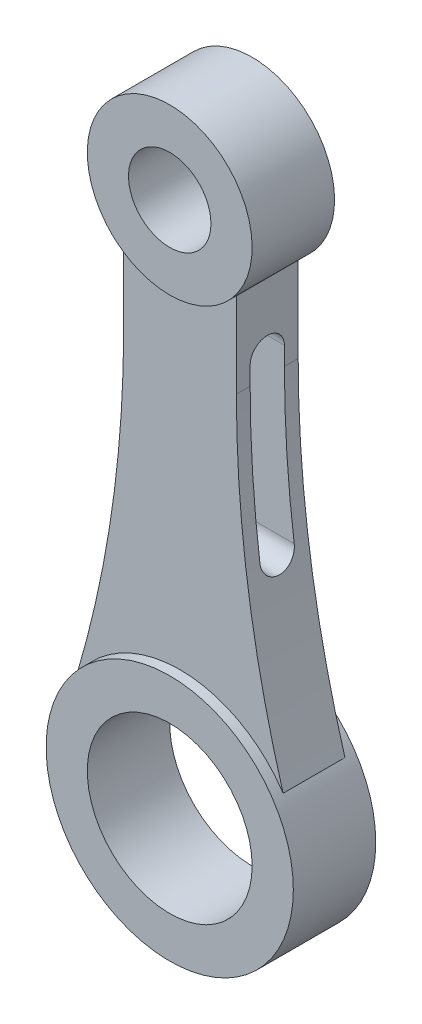
ISO-10303-21;
HEADER;
FILE_DESCRIPTION(('STEP AP214'),'2;1');
FILE_NAME('part.step','',(''),(''),'','','');
FILE_SCHEMA(('AUTOMOTIVE_DESIGN { 1 0 10303 214 1 1 1 1 }'));
ENDSEC;
DATA;
#1=APPLICATION_CONTEXT('core data for automotive mechanical design processes');
#2=APPLICATION_PROTOCOL_DEFINITION('international standard','automotive_design',2000,#1);
#3=PRODUCT_CONTEXT('',#1,'mechanical');
#4=PRODUCT('Part','Part','',(#3));
#5=PRODUCT_RELATED_PRODUCT_CATEGORY('part','',(#4));
#6=PRODUCT_DEFINITION_FORMATION('','',#4);
#7=PRODUCT_DEFINITION_CONTEXT('part definition',#1,'design');
#8=PRODUCT_DEFINITION('design','',#6,#7);
#9=PRODUCT_DEFINITION_SHAPE('','',#8);
#10=(LENGTH_UNIT() NAMED_UNIT(*) SI_UNIT(.MILLI.,.METRE.));
#11=(NAMED_UNIT(*) PLANE_ANGLE_UNIT() SI_UNIT($,.RADIAN.));
#12=(NAMED_UNIT(*) SI_UNIT($,.STERADIAN.) SOLID_ANGLE_UNIT());
#13=UNCERTAINTY_MEASURE_WITH_UNIT(LENGTH_MEASURE(1.E-05),#10,'distance_accuracy_value','');
#14=(GEOMETRIC_REPRESENTATION_CONTEXT(3) GLOBAL_UNCERTAINTY_ASSIGNED_CONTEXT((#13)) GLOBAL_UNIT_ASSIGNED_CONTEXT((#10,
#11,#12)) REPRESENTATION_CONTEXT('',''));
#15=CARTESIAN_POINT('',(0.,0.,0.));
#16=DIRECTION('',(0.,0.,1.));
#17=DIRECTION('',(1.,0.,0.));
#18=AXIS2_PLACEMENT_3D('',#15,#16,#17);
#19=CARTESIAN_POINT('',(288.972030603066,15.820153121076,7.5));
#20=DIRECTION('',(0.,0.,-1.));
#21=DIRECTION('',(-1.,0.,0.));
#22=AXIS2_PLACEMENT_3D('',#19,#20,#21);
#23=CYLINDRICAL_SURFACE('',#22,275.291564850654);
#24=CARTESIAN_POINT('',(288.972030603066,15.820153121076,-4.15667908285283));
#25=DIRECTION('',(0.,0.,-1.));
#26=DIRECTION('',(-1.,0.,0.));
#27=AXIS2_PLACEMENT_3D('',#24,#25,#26);
#28=CIRCLE('',#27,275.291564850654);
#29=CARTESIAN_POINT('',(16.0549031940235,-20.2587499209833,-4.15667908285283));
#30=VERTEX_POINT('',#29);
#31=CARTESIAN_POINT('',(13.6804657524121,15.8201531210742,-4.15667908285283));
#32=VERTEX_POINT('',#31);
#33=EDGE_CURVE('E280',#30,#32,#28,.T.);
#34=ORIENTED_EDGE('',*,*,#33,.F.);
#35=CARTESIAN_POINT('',(16.0549031940235,-20.2587499209833,4.15667908285283));
#36=CARTESIAN_POINT('',(16.0704750097521,-20.3765480732176,4.15669109499393));
#37=CARTESIAN_POINT('',(16.0861243485884,-20.4943340439329,4.15167208317998));
#38=CARTESIAN_POINT('',(16.117462026951,-20.7290464404043,4.13166399065926));
#39=CARTESIAN_POINT('',(16.1331503649198,-20.8459728997726,4.11667530194636));
#40=CARTESIAN_POINT('',(16.1644436258058,-21.0780840185345,4.07682951459496));
#41=CARTESIAN_POINT('',(16.1800485855865,-21.1932694975232,4.05197721978021));
#42=CARTESIAN_POINT('',(16.2110637106805,-21.421138908205,3.99257985109576));
#43=CARTESIAN_POINT('',(16.226473878494,-21.5338228720189,3.95803490176329));
#44=CARTESIAN_POINT('',(16.256984243972,-21.7559262394368,3.87947477803732));
#45=CARTESIAN_POINT('',(16.2720843370173,-21.8653445466753,3.83545646302295));
#46=CARTESIAN_POINT('',(16.3018533053091,-22.0801351480103,3.73824000055474));
#47=CARTESIAN_POINT('',(16.3165220190609,-22.1855059312499,3.685038465132));
#48=CARTESIAN_POINT('',(16.3452922923064,-22.391337690277,3.56986691507419));
#49=CARTESIAN_POINT('',(16.3593941903908,-22.4918016051676,3.50790223821111));
#50=CARTESIAN_POINT('',(16.38692560726,-22.6871962030394,3.37558239559216));
#51=CARTESIAN_POINT('',(16.4003548771866,-22.7821248401878,3.30522415648358));
#52=CARTESIAN_POINT('',(16.4263729956737,-22.9653949072757,3.15688199766906));
#53=CARTESIAN_POINT('',(16.4389646026604,-23.0537580824605,3.0789254282231));
#54=CARTESIAN_POINT('',(16.4632509047328,-23.2236432199694,2.91569375558122));
#55=CARTESIAN_POINT('',(16.4749452656218,-23.3051626342577,2.83041595026955));
#56=CARTESIAN_POINT('',(16.4973225703017,-23.4606988819621,2.65318691462642));
#57=CARTESIAN_POINT('',(16.5080057646781,-23.5347175745175,2.56123734771108));
#58=CARTESIAN_POINT('',(16.5282682690525,-23.674745939291,2.37126163432076));
#59=CARTESIAN_POINT('',(16.5378471731989,-23.7407526673991,2.27323327397858));
#60=CARTESIAN_POINT('',(16.5557209761364,-23.8636439276749,2.07277864843456));
#61=CARTESIAN_POINT('',(16.5640270875125,-23.9206082999292,1.97040232499818));
#62=CARTESIAN_POINT('',(16.5793859557047,-24.0257456024338,1.76109219362114));
#63=CARTESIAN_POINT('',(16.5864382492999,-24.0739152836775,1.65415671932486));
#64=CARTESIAN_POINT('',(16.5992142815433,-24.1610492991238,1.43658137523913));
#65=CARTESIAN_POINT('',(16.6049386596134,-24.2000180639418,1.3259433178196));
#66=CARTESIAN_POINT('',(16.615009018863,-24.2684945167983,1.10167288386381));
#67=CARTESIAN_POINT('',(16.6193544938695,-24.2979987305957,0.988039424303515));
#68=CARTESIAN_POINT('',(16.62658444997,-24.3470505757274,0.75977784754567));
#69=CARTESIAN_POINT('',(16.6294830808742,-24.3666946480874,0.645170979485073));
#70=CARTESIAN_POINT('',(16.6338574959347,-24.3963279363351,0.414677459145485));
#71=CARTESIAN_POINT('',(16.6353327570886,-24.4063136033452,0.29879035226344));
#72=CARTESIAN_POINT('',(16.6375916159939,-24.4216074893232,-0.0494558675508221));
#73=CARTESIAN_POINT('',(16.6362162655536,-24.4123065739147,-0.282652058389253));
#74=CARTESIAN_POINT('',(16.6277655878344,-24.3550601302369,-0.742833795180447));
#75=CARTESIAN_POINT('',(16.62071859089,-24.3073066749393,-0.96984442571743));
#76=CARTESIAN_POINT('',(16.6012367613109,-24.1748565020315,-1.41260430430548));
#77=CARTESIAN_POINT('',(16.5888019159399,-24.090159697092,-1.62835352573473));
#78=CARTESIAN_POINT('',(16.5589761590796,-23.8860687631105,-2.0430619818794));
#79=CARTESIAN_POINT('',(16.5415726466099,-23.7665863993971,-2.24197683878745));
#80=CARTESIAN_POINT('',(16.5024634081142,-23.4964995654215,-2.6169316652615));
#81=CARTESIAN_POINT('',(16.4807577236965,-23.3458953961527,-2.79297185603215));
#82=CARTESIAN_POINT('',(16.4336197138268,-23.0165324433995,-3.11877449903784));
#83=CARTESIAN_POINT('',(16.4081577327821,-22.8375486767689,-3.26830481070464));
#84=CARTESIAN_POINT('',(16.3544891033389,-22.4572354955944,-3.53533233211329));
#85=CARTESIAN_POINT('',(16.3262814395494,-22.2558978103655,-3.652817629634));
#86=CARTESIAN_POINT('',(16.2824958580279,-21.940604806989,-3.80304597232787));
#87=CARTESIAN_POINT('',(16.2675666941747,-21.8326467119248,-3.84897248428845));
#88=CARTESIAN_POINT('',(16.2373697333055,-21.6132899430774,-3.9315276179245));
#89=CARTESIAN_POINT('',(16.2221020614005,-21.5018925346648,-3.96815961451344));
#90=CARTESIAN_POINT('',(16.1913634448971,-21.2765614057563,-4.03184104505021));
#91=CARTESIAN_POINT('',(16.1758927345791,-21.1626305184068,-4.05890066214979));
#92=CARTESIAN_POINT('',(16.144853475086,-20.9329489665742,-4.10330422626165));
#93=CARTESIAN_POINT('',(16.1292849769129,-20.8171992099641,-4.12065287138709));
#94=CARTESIAN_POINT('',(16.1038891978573,-20.6274611484018,-4.14095374530003));
#95=CARTESIAN_POINT('',(16.0940570014208,-20.553776157277,-4.14685429102821));
#96=CARTESIAN_POINT('',(16.0744412992162,-20.4063146163928,-4.15471407109939));
#97=CARTESIAN_POINT('',(16.0646577397256,-20.3325384214504,-4.15667982923061));
#98=CARTESIAN_POINT('',(16.0549031940235,-20.2587499209833,-4.15667908285283));
#99=B_SPLINE_CURVE_WITH_KNOTS('',3,(#35,#36,#37,#38,#39,#40,#41,#42,#43,#44,#45,#46,#47,#48,#49,
#50,#51,#52,#53,#54,#55,#56,#57,#58,#59,#60,#61,#62,#63,#64,#65,#66,#67,#68,#69,#70,#71,#72,#73,
#74,#75,#76,#77,#78,#79,#80,#81,#82,#83,#84,#85,#86,#87,#88,#89,#90,#91,#92,#93,#94,#95,#96,#97,
#98),.UNSPECIFIED.,.F.,.F.,(4,2,2,2,2,2,2,2,2,2,2,2,2,2,2,2,2,2,2,2,2,2,2,2,2,2,2,2,2,2,2,4),
(0.,0.356360122110577,0.712706233463274,1.06887900786146,1.42504720614111,1.78133366409383,
2.13775184898646,2.4939538614253,2.85028670198657,3.20538122444211,3.56060737300243,
3.91574525823706,4.27101325137021,4.62294516003498,4.97500682034743,5.32689860130546,
5.67891940703861,6.02742655795546,6.37606171550282,7.07256784322536,7.76561630007947,
8.45866639521693,9.1534899823752,9.8483068498878,10.5489360788957,11.2498254017442,
11.6042840321903,11.9586137710613,12.3125654303134,12.6663457014296,12.8899655255622,
13.113214285),.UNSPECIFIED.);
#100=CARTESIAN_POINT('',(16.0549031940235,-20.2587499209833,4.15667908285283));
#101=VERTEX_POINT('',#100);
#102=EDGE_CURVE('E216',#101,#30,#99,.T.);
#103=ORIENTED_EDGE('',*,*,#102,.F.);
#104=CARTESIAN_POINT('',(288.972030603066,15.820153121076,4.15667908285283));
#105=DIRECTION('',(0.,0.,1.));
#106=DIRECTION('',(1.,0.,0.));
#107=AXIS2_PLACEMENT_3D('',#104,#105,#106);
#108=CIRCLE('',#107,275.291564850654);
#109=CARTESIAN_POINT('',(13.6804657524121,15.8201531210742,4.15667908285283));
#110=VERTEX_POINT('',#109);
#111=EDGE_CURVE('E214',#110,#101,#108,.T.);
#112=ORIENTED_EDGE('',*,*,#111,.F.);
#113=DIRECTION('',(0.,0.,-1.));
#114=VECTOR('',#113,1.);
#115=CARTESIAN_POINT('',(13.6804657524121,15.8201531210742,7.5));
#116=LINE('',#115,#114);
#117=CARTESIAN_POINT('',(13.6804657524121,15.8201531210742,7.5));
#118=VERTEX_POINT('',#117);
#119=EDGE_CURVE('E286',#118,#110,#116,.T.);
#120=ORIENTED_EDGE('',*,*,#119,.F.);
#121=CARTESIAN_POINT('',(288.972030603066,15.820153121076,7.5));
#122=DIRECTION('',(0.,0.,1.));
#123=DIRECTION('',(1.,0.,0.));
#124=AXIS2_PLACEMENT_3D('',#121,#122,#123);
#125=CIRCLE('',#124,275.291564850654);
#126=CARTESIAN_POINT('',(25.0234279366621,-62.3884194804921,7.5));
#127=VERTEX_POINT('',#126);
#128=EDGE_CURVE('E305',#118,#127,#125,.T.);
#129=ORIENTED_EDGE('',*,*,#128,.T.);
#130=DIRECTION('',(0.,0.,-1.));
#131=VECTOR('',#130,1.);
#132=CARTESIAN_POINT('',(25.0234279366621,-62.3884194804921,7.5));
#133=LINE('',#132,#131);
#134=CARTESIAN_POINT('',(25.0234279366621,-62.3884194804921,-7.5));
#135=VERTEX_POINT('',#134);
#136=EDGE_CURVE('E299',#127,#135,#133,.T.);
#137=ORIENTED_EDGE('',*,*,#136,.T.);
#138=CARTESIAN_POINT('',(288.972030603066,15.820153121076,-7.5));
#139=DIRECTION('',(0.,0.,1.));
#140=DIRECTION('',(1.,0.,0.));
#141=AXIS2_PLACEMENT_3D('',#138,#139,#140);
#142=CIRCLE('',#141,275.291564850654);
#143=CARTESIAN_POINT('',(13.6804657524121,15.8201531210742,-7.5));
#144=VERTEX_POINT('',#143);
#145=EDGE_CURVE('E284',#144,#135,#142,.T.);
#146=ORIENTED_EDGE('',*,*,#145,.F.);
#147=EDGE_CURVE('E274',#32,#144,#116,.T.);
#148=ORIENTED_EDGE('',*,*,#147,.F.);
#149=EDGE_LOOP('',(#34,#103,#112,#120,#129,#137,#146,#148));
#150=FACE_BOUND('',#149,.T.);
#151=ADVANCED_FACE('F47',(#150),#23,.F.);
#152=CARTESIAN_POINT('',(13.6804657524122,0.,7.5));
#153=DIRECTION('',(1.,0.,0.));
#154=DIRECTION('',(0.,1.,0.));
#155=AXIS2_PLACEMENT_3D('',#152,#153,#154);
#156=PLANE('',#155);
#157=DIRECTION('',(0.,1.,0.));
#158=VECTOR('',#157,1.);
#159=CARTESIAN_POINT('',(13.6804657524122,0.,-4.15667908285283));
#160=LINE('',#159,#158);
#161=CARTESIAN_POINT('',(13.680465752412,20.2587499209833,-4.15667908285283));
#162=VERTEX_POINT('',#161);
#163=EDGE_CURVE('E271',#32,#162,#160,.T.);
#164=ORIENTED_EDGE('',*,*,#163,.F.);
#165=ORIENTED_EDGE('',*,*,#147,.T.);
#166=DIRECTION('',(0.,-1.,0.));
#167=VECTOR('',#166,1.);
#168=CARTESIAN_POINT('',(13.6804657524122,0.,-7.5));
#169=LINE('',#168,#167);
#170=CARTESIAN_POINT('',(13.6804657524119,36.4746263546214,-7.5));
#171=VERTEX_POINT('',#170);
#172=EDGE_CURVE('E315',#171,#144,#169,.T.);
#173=ORIENTED_EDGE('',*,*,#172,.F.);
#174=DIRECTION('',(0.,0.,-1.));
#175=VECTOR('',#174,1.);
#176=CARTESIAN_POINT('',(13.6804657524119,36.4746263546214,7.5));
#177=LINE('',#176,#175);
#178=CARTESIAN_POINT('',(13.6804657524119,36.4746263546214,7.5));
#179=VERTEX_POINT('',#178);
#180=EDGE_CURVE('E287',#179,#171,#177,.T.);
#181=ORIENTED_EDGE('',*,*,#180,.F.);
#182=DIRECTION('',(0.,-1.,0.));
#183=VECTOR('',#182,1.);
#184=CARTESIAN_POINT('',(13.6804657524122,0.,7.5));
#185=LINE('',#184,#183);
#186=EDGE_CURVE('E327',#179,#118,#185,.T.);
#187=ORIENTED_EDGE('',*,*,#186,.T.);
#188=ORIENTED_EDGE('',*,*,#119,.T.);
#189=DIRECTION('',(0.,-1.,0.));
#190=VECTOR('',#189,1.);
#191=CARTESIAN_POINT('',(13.6804657524122,0.,4.15667908285283));
#192=LINE('',#191,#190);
#193=CARTESIAN_POINT('',(13.680465752412,20.2587499209833,4.15667908285283));
#194=VERTEX_POINT('',#193);
#195=EDGE_CURVE('E212',#194,#110,#192,.T.);
#196=ORIENTED_EDGE('',*,*,#195,.F.);
#197=CARTESIAN_POINT('',(13.680465752412,20.2587499209833,0.));
#198=DIRECTION('',(1.,0.,0.));
#199=DIRECTION('',(0.,1.,0.));
#200=AXIS2_PLACEMENT_3D('',#197,#198,#199);
#201=CIRCLE('',#200,4.15667908285283);
#202=EDGE_CURVE('E277',#162,#194,#201,.T.);
#203=ORIENTED_EDGE('',*,*,#202,.F.);
#204=EDGE_LOOP('',(#164,#165,#173,#181,#187,#188,#196,#203));
#205=FACE_BOUND('',#204,.T.);
#206=ADVANCED_FACE('F261',(#205),#156,.T.);
#207=CARTESIAN_POINT('',(0.,51.0638297871971,7.5));
#208=DIRECTION('',(0.,0.,-1.));
#209=DIRECTION('',(-1.,0.,0.));
#210=AXIS2_PLACEMENT_3D('',#207,#208,#209);
#211=CYLINDRICAL_SURFACE('',#210,20.);
#212=CARTESIAN_POINT('',(0.,51.0638297871971,-7.5));
#213=DIRECTION('',(0.,0.,1.));
#214=DIRECTION('',(1.,0.,0.));
#215=AXIS2_PLACEMENT_3D('',#212,#213,#214);
#216=CIRCLE('',#215,20.);
#217=CARTESIAN_POINT('',(-13.6804657524122,36.4746263546214,-7.5));
#218=VERTEX_POINT('',#217);
#219=EDGE_CURVE('E312',#218,#171,#216,.T.);
#220=ORIENTED_EDGE('',*,*,#219,.F.);
#221=DIRECTION('',(0.,0.,-1.));
#222=VECTOR('',#221,1.);
#223=CARTESIAN_POINT('',(-13.6804657524122,36.4746263546214,7.5));
#224=LINE('',#223,#222);
#225=CARTESIAN_POINT('',(-13.6804657524122,36.4746263546214,7.5));
#226=VERTEX_POINT('',#225);
#227=EDGE_CURVE('E289',#226,#218,#224,.T.);
#228=ORIENTED_EDGE('',*,*,#227,.F.);
#229=CARTESIAN_POINT('',(0.,51.0638297871971,7.5));
#230=DIRECTION('',(0.,0.,1.));
#231=DIRECTION('',(1.,0.,0.));
#232=AXIS2_PLACEMENT_3D('',#229,#230,#231);
#233=CIRCLE('',#232,20.);
#234=EDGE_CURVE('E324',#226,#179,#233,.T.);
#235=ORIENTED_EDGE('',*,*,#234,.T.);
#236=ORIENTED_EDGE('',*,*,#180,.T.);
#237=EDGE_LOOP('',(#220,#228,#235,#236));
#238=FACE_BOUND('',#237,.T.);
#239=ADVANCED_FACE('F258',(#238),#211,.F.);
#240=CARTESIAN_POINT('',(-13.6804657524122,0.,7.5));
#241=DIRECTION('',(1.,0.,0.));
#242=DIRECTION('',(0.,1.,0.));
#243=AXIS2_PLACEMENT_3D('',#240,#241,#242);
#244=PLANE('',#243);
#245=DIRECTION('',(0.,0.,-1.));
#246=VECTOR('',#245,1.);
#247=CARTESIAN_POINT('',(-13.6804657524122,15.8201531210742,7.5));
#248=LINE('',#247,#246);
#249=CARTESIAN_POINT('',(-13.6804657524121,15.8201531210742,-4.15667908285283));
#250=VERTEX_POINT('',#249);
#251=CARTESIAN_POINT('',(-13.6804657524122,15.8201531210742,-7.5));
#252=VERTEX_POINT('',#251);
#253=EDGE_CURVE('E296',#250,#252,#248,.T.);
#254=ORIENTED_EDGE('',*,*,#253,.F.);
#255=DIRECTION('',(0.,1.,0.));
#256=VECTOR('',#255,1.);
#257=CARTESIAN_POINT('',(-13.6804657524122,0.,-4.15667908285283));
#258=LINE('',#257,#256);
#259=CARTESIAN_POINT('',(-13.6804657524122,20.2587499209833,-4.15667908285283));
#260=VERTEX_POINT('',#259);
#261=EDGE_CURVE('E223',#250,#260,#258,.T.);
#262=ORIENTED_EDGE('',*,*,#261,.T.);
#263=CARTESIAN_POINT('',(-13.6804657524122,20.2587499209833,0.));
#264=DIRECTION('',(1.,0.,0.));
#265=DIRECTION('',(0.,1.,0.));
#266=AXIS2_PLACEMENT_3D('',#263,#264,#265);
#267=CIRCLE('',#266,4.15667908285283);
#268=CARTESIAN_POINT('',(-13.6804657524122,20.2587499209833,4.15667908285283));
#269=VERTEX_POINT('',#268);
#270=EDGE_CURVE('E12',#260,#269,#267,.T.);
#271=ORIENTED_EDGE('',*,*,#270,.T.);
#272=DIRECTION('',(0.,-1.,0.));
#273=VECTOR('',#272,1.);
#274=CARTESIAN_POINT('',(-13.6804657524122,0.,4.15667908285283));
#275=LINE('',#274,#273);
#276=CARTESIAN_POINT('',(-13.6804657524121,15.8201531210742,4.15667908285283));
#277=VERTEX_POINT('',#276);
#278=EDGE_CURVE('E204',#269,#277,#275,.T.);
#279=ORIENTED_EDGE('',*,*,#278,.T.);
#280=CARTESIAN_POINT('',(-13.6804657524122,15.8201531210742,7.5));
#281=VERTEX_POINT('',#280);
#282=EDGE_CURVE('E293',#281,#277,#248,.T.);
#283=ORIENTED_EDGE('',*,*,#282,.F.);
#284=DIRECTION('',(0.,-1.,0.));
#285=VECTOR('',#284,1.);
#286=CARTESIAN_POINT('',(-13.6804657524122,0.,7.5));
#287=LINE('',#286,#285);
#288=EDGE_CURVE('E322',#226,#281,#287,.T.);
#289=ORIENTED_EDGE('',*,*,#288,.F.);
#290=ORIENTED_EDGE('',*,*,#227,.T.);
#291=DIRECTION('',(0.,-1.,0.));
#292=VECTOR('',#291,1.);
#293=CARTESIAN_POINT('',(-13.6804657524122,0.,-7.5));
#294=LINE('',#293,#292);
#295=EDGE_CURVE('E309',#218,#252,#294,.T.);
#296=ORIENTED_EDGE('',*,*,#295,.T.);
#297=EDGE_LOOP('',(#254,#262,#271,#279,#283,#289,#290,#296));
#298=FACE_BOUND('',#297,.T.);
#299=ADVANCED_FACE('F253',(#298),#244,.F.);
#300=CARTESIAN_POINT('',(-288.972030603066,15.8201531210742,7.5));
#301=DIRECTION('',(0.,0.,-1.));
#302=DIRECTION('',(-1.,0.,0.));
#303=AXIS2_PLACEMENT_3D('',#300,#301,#302);
#304=CYLINDRICAL_SURFACE('',#303,275.291564850654);
#305=CARTESIAN_POINT('',(-16.0549031940234,-20.2587499209833,4.15667908285283));
#306=CARTESIAN_POINT('',(-16.0704750097519,-20.3765480732176,4.15669109499393));
#307=CARTESIAN_POINT('',(-16.0861243485883,-20.4943340439329,4.15167208317998));
#308=CARTESIAN_POINT('',(-16.1174620269509,-20.7290464404043,4.13166399065926));
#309=CARTESIAN_POINT('',(-16.1331503649197,-20.8459728997726,4.11667530194636));
#310=CARTESIAN_POINT('',(-16.1644436258057,-21.0780840185345,4.07682951459496));
#311=CARTESIAN_POINT('',(-16.1800485855863,-21.1932694975232,4.05197721978021));
#312=CARTESIAN_POINT('',(-16.2110637106804,-21.4211389082049,3.99257985109576));
#313=CARTESIAN_POINT('',(-16.2264738784939,-21.5338228720189,3.95803490176329));
#314=CARTESIAN_POINT('',(-16.2569842439719,-21.7559262394368,3.87947477803732));
#315=CARTESIAN_POINT('',(-16.2720843370171,-21.8653445466753,3.83545646302296));
#316=CARTESIAN_POINT('',(-16.301853305309,-22.0801351480103,3.73824000055475));
#317=CARTESIAN_POINT('',(-16.3165220190608,-22.1855059312499,3.68503846513201));
#318=CARTESIAN_POINT('',(-16.3452922923063,-22.391337690277,3.5698669150742));
#319=CARTESIAN_POINT('',(-16.3593941903907,-22.4918016051676,3.50790223821112));
#320=CARTESIAN_POINT('',(-16.3869256072598,-22.6871962030394,3.37558239559216));
#321=CARTESIAN_POINT('',(-16.4003548771865,-22.7821248401878,3.30522415648358));
#322=CARTESIAN_POINT('',(-16.4263729956735,-22.9653949072757,3.15688199766908));
#323=CARTESIAN_POINT('',(-16.4389646026602,-23.0537580824605,3.07892542822311));
#324=CARTESIAN_POINT('',(-16.4632509047326,-23.2236432199694,2.91569375558124));
#325=CARTESIAN_POINT('',(-16.4749452656216,-23.3051626342577,2.83041595026956));
#326=CARTESIAN_POINT('',(-16.4973225703015,-23.460698881962,2.65318691462643));
#327=CARTESIAN_POINT('',(-16.508005764678,-23.5347175745175,2.56123734771109));
#328=CARTESIAN_POINT('',(-16.5282682690524,-23.674745939291,2.37126163432077));
#329=CARTESIAN_POINT('',(-16.5378471731987,-23.7407526673991,2.27323327397858));
#330=CARTESIAN_POINT('',(-16.5557209761362,-23.8636439276749,2.07277864843457));
#331=CARTESIAN_POINT('',(-16.5640270875124,-23.9206082999291,1.9704023249982));
#332=CARTESIAN_POINT('',(-16.5793859557046,-24.0257456024338,1.76109219362116));
#333=CARTESIAN_POINT('',(-16.5864382492998,-24.0739152836775,1.65415671932488));
#334=CARTESIAN_POINT('',(-16.5992142815431,-24.1610492991238,1.43658137523914));
#335=CARTESIAN_POINT('',(-16.6049386596132,-24.2000180639418,1.32594331781962));
#336=CARTESIAN_POINT('',(-16.6150090188628,-24.2684945167983,1.10167288386383));
#337=CARTESIAN_POINT('',(-16.6193544938693,-24.2979987305957,0.988039424303529));
#338=CARTESIAN_POINT('',(-16.6265844499699,-24.3470505757274,0.759777847545686));
#339=CARTESIAN_POINT('',(-16.629483080874,-24.3666946480874,0.64517097948509));
#340=CARTESIAN_POINT('',(-16.6338574959346,-24.3963279363351,0.414677459145503));
#341=CARTESIAN_POINT('',(-16.6353327570884,-24.4063136033452,0.298790352263457));
#342=CARTESIAN_POINT('',(-16.6375916159936,-24.4216074893232,-0.0494558675508058));
#343=CARTESIAN_POINT('',(-16.6362162655535,-24.4123065739147,-0.282652058389237));
#344=CARTESIAN_POINT('',(-16.6277655878343,-24.3550601302369,-0.74283379518043));
#345=CARTESIAN_POINT('',(-16.6207185908899,-24.3073066749393,-0.969844425717413));
#346=CARTESIAN_POINT('',(-16.6012367613107,-24.1748565020315,-1.41260430430547));
#347=CARTESIAN_POINT('',(-16.5888019159398,-24.090159697092,-1.62835352573471));
#348=CARTESIAN_POINT('',(-16.5589761590794,-23.8860687631105,-2.04306198187938));
#349=CARTESIAN_POINT('',(-16.5415726466098,-23.7665863993971,-2.24197683878744));
#350=CARTESIAN_POINT('',(-16.5024634081141,-23.4964995654215,-2.61693166526149));
#351=CARTESIAN_POINT('',(-16.4807577236964,-23.3458953961527,-2.79297185603214));
#352=CARTESIAN_POINT('',(-16.4336197138267,-23.0165324433995,-3.11877449903783));
#353=CARTESIAN_POINT('',(-16.4081577327819,-22.8375486767689,-3.26830481070463));
#354=CARTESIAN_POINT('',(-16.3544891033387,-22.4572354955944,-3.53533233211328));
#355=CARTESIAN_POINT('',(-16.3262814395493,-22.2558978103655,-3.65281762963399));
#356=CARTESIAN_POINT('',(-16.2824958580277,-21.9406048069891,-3.80304597232786));
#357=CARTESIAN_POINT('',(-16.2675666941745,-21.8326467119248,-3.84897248428844));
#358=CARTESIAN_POINT('',(-16.2373697333053,-21.6132899430774,-3.9315276179245));
#359=CARTESIAN_POINT('',(-16.2221020614003,-21.5018925346648,-3.96815961451343));
#360=CARTESIAN_POINT('',(-16.1913634448969,-21.2765614057564,-4.0318410450502));
#361=CARTESIAN_POINT('',(-16.175892734579,-21.1626305184068,-4.05890066214978));
#362=CARTESIAN_POINT('',(-16.1448534750859,-20.9329489665742,-4.10330422626165));
#363=CARTESIAN_POINT('',(-16.1292849769129,-20.8171992099641,-4.12065287138709));
#364=CARTESIAN_POINT('',(-16.1038891978572,-20.6274611484018,-4.14095374530002));
#365=CARTESIAN_POINT('',(-16.0940570014207,-20.553776157277,-4.14685429102821));
#366=CARTESIAN_POINT('',(-16.0744412992161,-20.4063146163929,-4.15471407109939));
#367=CARTESIAN_POINT('',(-16.0646577397255,-20.3325384214504,-4.15667982923061));
#368=CARTESIAN_POINT('',(-16.0549031940234,-20.2587499209833,-4.15667908285283));
#369=B_SPLINE_CURVE_WITH_KNOTS('',3,(#305,#306,#307,#308,#309,#310,#311,#312,#313,#314,#315,
#316,#317,#318,#319,#320,#321,#322,#323,#324,#325,#326,#327,#328,#329,#330,#331,#332,#333,#334,
#335,#336,#337,#338,#339,#340,#341,#342,#343,#344,#345,#346,#347,#348,#349,#350,#351,#352,#353,
#354,#355,#356,#357,#358,#359,#360,#361,#362,#363,#364,#365,#366,#367,#368),.UNSPECIFIED.,.F.,
.F.,(4,2,2,2,2,2,2,2,2,2,2,2,2,2,2,2,2,2,2,2,2,2,2,2,2,2,2,2,2,2,2,4),(0.,0.356360122110577,
0.712706233463273,1.06887900786146,1.4250472061411,1.78133366409381,2.13775184898645,
2.49395386142528,2.85028670198655,3.20538122444209,3.56060737300241,3.91574525823705,
4.27101325137019,4.62294516003496,4.97500682034741,5.32689860130544,5.67891940703859,
6.02742655795544,6.3760617155028,7.07256784322534,7.76561630007945,8.45866639521691,
9.15348998237518,9.84830684988778,10.5489360788957,11.2498254017442,11.6042840321902,
11.9586137710613,12.3125654303134,12.6663457014296,12.8899655255622,13.113214285),.UNSPECIFIED.);
#370=CARTESIAN_POINT('',(-16.0549031940234,-20.2587499209833,4.15667908285283));
#371=VERTEX_POINT('',#370);
#372=CARTESIAN_POINT('',(-16.0549031940234,-20.2587499209833,-4.15667908285283));
#373=VERTEX_POINT('',#372);
#374=EDGE_CURVE('E237',#371,#373,#369,.T.);
#375=ORIENTED_EDGE('',*,*,#374,.T.);
#376=CARTESIAN_POINT('',(-288.972030603066,15.8201531210742,-4.15667908285283));
#377=DIRECTION('',(0.,0.,-1.));
#378=DIRECTION('',(-1.,0.,0.));
#379=AXIS2_PLACEMENT_3D('',#376,#377,#378);
#380=CIRCLE('',#379,275.291564850654);
#381=EDGE_CURVE('E55',#373,#250,#380,.F.);
#382=ORIENTED_EDGE('',*,*,#381,.T.);
#383=ORIENTED_EDGE('',*,*,#253,.T.);
#384=CARTESIAN_POINT('',(-288.972030603066,15.8201531210742,-7.5));
#385=DIRECTION('',(0.,0.,1.));
#386=DIRECTION('',(1.,0.,0.));
#387=AXIS2_PLACEMENT_3D('',#384,#385,#386);
#388=CIRCLE('',#387,275.291564850654);
#389=CARTESIAN_POINT('',(-25.0234279366618,-62.3884194804925,-7.5));
#390=VERTEX_POINT('',#389);
#391=EDGE_CURVE('E306',#252,#390,#388,.F.);
#392=ORIENTED_EDGE('',*,*,#391,.T.);
#393=DIRECTION('',(0.,0.,-1.));
#394=VECTOR('',#393,1.);
#395=CARTESIAN_POINT('',(-25.0234279366618,-62.3884194804925,7.5));
#396=LINE('',#395,#394);
#397=CARTESIAN_POINT('',(-25.0234279366618,-62.3884194804925,7.5));
#398=VERTEX_POINT('',#397);
#399=EDGE_CURVE('E297',#398,#390,#396,.T.);
#400=ORIENTED_EDGE('',*,*,#399,.F.);
#401=CARTESIAN_POINT('',(-288.972030603066,15.8201531210742,7.5));
#402=DIRECTION('',(0.,0.,1.));
#403=DIRECTION('',(1.,0.,0.));
#404=AXIS2_PLACEMENT_3D('',#401,#402,#403);
#405=CIRCLE('',#404,275.291564850654);
#406=EDGE_CURVE('E320',#281,#398,#405,.F.);
#407=ORIENTED_EDGE('',*,*,#406,.F.);
#408=ORIENTED_EDGE('',*,*,#282,.T.);
#409=CARTESIAN_POINT('',(-288.972030603066,15.8201531210742,4.15667908285283));
#410=DIRECTION('',(0.,0.,1.));
#411=DIRECTION('',(1.,0.,0.));
#412=AXIS2_PLACEMENT_3D('',#409,#410,#411);
#413=CIRCLE('',#412,275.291564850654);
#414=EDGE_CURVE('E245',#277,#371,#413,.F.);
#415=ORIENTED_EDGE('',*,*,#414,.T.);
#416=EDGE_LOOP('',(#375,#382,#383,#392,#400,#407,#408,#415));
#417=FACE_BOUND('',#416,.T.);
#418=ADVANCED_FACE('F247',(#417),#304,.F.);
#419=CARTESIAN_POINT('',(2.70770718848287E-13,-78.9361702128029,7.5));
#420=DIRECTION('',(0.,0.,-1.));
#421=DIRECTION('',(-1.,0.,0.));
#422=AXIS2_PLACEMENT_3D('',#419,#420,#421);
#423=CYLINDRICAL_SURFACE('',#422,30.);
#424=CARTESIAN_POINT('',(2.70770718848287E-13,-78.9361702128029,-7.5));
#425=DIRECTION('',(0.,0.,1.));
#426=DIRECTION('',(1.,0.,0.));
#427=AXIS2_PLACEMENT_3D('',#424,#425,#426);
#428=CIRCLE('',#427,30.);
#429=EDGE_CURVE('E302',#135,#390,#428,.T.);
#430=ORIENTED_EDGE('',*,*,#429,.F.);
#431=ORIENTED_EDGE('',*,*,#136,.F.);
#432=CARTESIAN_POINT('',(2.70770718848287E-13,-78.9361702128029,7.5));
#433=DIRECTION('',(0.,0.,1.));
#434=DIRECTION('',(1.,0.,0.));
#435=AXIS2_PLACEMENT_3D('',#432,#433,#434);
#436=CIRCLE('',#435,30.);
#437=EDGE_CURVE('E301',#127,#398,#436,.T.);
#438=ORIENTED_EDGE('',*,*,#437,.T.);
#439=ORIENTED_EDGE('',*,*,#399,.T.);
#440=EDGE_LOOP('',(#430,#431,#438,#439));
#441=FACE_BOUND('',#440,.T.);
#442=ADVANCED_FACE('F252',(#441),#423,.F.);
#443=CARTESIAN_POINT('',(0.,0.,7.5));
#444=DIRECTION('',(0.,0.,1.));
#445=DIRECTION('',(1.,0.,0.));
#446=AXIS2_PLACEMENT_3D('',#443,#444,#445);
#447=PLANE('',#446);
#448=ORIENTED_EDGE('',*,*,#128,.F.);
#449=ORIENTED_EDGE('',*,*,#186,.F.);
#450=ORIENTED_EDGE('',*,*,#234,.F.);
#451=ORIENTED_EDGE('',*,*,#288,.T.);
#452=ORIENTED_EDGE('',*,*,#406,.T.);
#453=ORIENTED_EDGE('',*,*,#437,.F.);
#454=EDGE_LOOP('',(#448,#449,#450,#451,#452,#453));
#455=FACE_BOUND('',#454,.T.);
#456=ADVANCED_FACE('F348',(#455),#447,.T.);
#457=CARTESIAN_POINT('',(0.,0.,-7.5));
#458=DIRECTION('',(0.,0.,1.));
#459=DIRECTION('',(1.,0.,0.));
#460=AXIS2_PLACEMENT_3D('',#457,#458,#459);
#461=PLANE('',#460);
#462=ORIENTED_EDGE('',*,*,#145,.T.);
#463=ORIENTED_EDGE('',*,*,#429,.T.);
#464=ORIENTED_EDGE('',*,*,#391,.F.);
#465=ORIENTED_EDGE('',*,*,#295,.F.);
#466=ORIENTED_EDGE('',*,*,#219,.T.);
#467=ORIENTED_EDGE('',*,*,#172,.T.);
#468=EDGE_LOOP('',(#462,#463,#464,#465,#466,#467));
#469=FACE_BOUND('',#468,.T.);
#470=ADVANCED_FACE('F355',(#469),#461,.F.);
#471=CARTESIAN_POINT('',(-29.9999999999997,20.2587499209833,0.));
#472=DIRECTION('',(1.,0.,0.));
#473=DIRECTION('',(0.,0.,-1.));
#474=AXIS2_PLACEMENT_3D('',#471,#472,#473);
#475=CYLINDRICAL_SURFACE('',#474,4.15667908285283);
#476=ORIENTED_EDGE('',*,*,#202,.T.);
#477=DIRECTION('',(1.,0.,0.));
#478=VECTOR('',#477,1.);
#479=CARTESIAN_POINT('',(-29.9999999999997,20.2587499209833,4.15667908285283));
#480=LINE('',#479,#478);
#481=EDGE_CURVE('E62',#269,#194,#480,.T.);
#482=ORIENTED_EDGE('',*,*,#481,.F.);
#483=ORIENTED_EDGE('',*,*,#270,.F.);
#484=DIRECTION('',(1.,0.,0.));
#485=VECTOR('',#484,1.);
#486=CARTESIAN_POINT('',(-29.9999999999997,20.2587499209833,-4.15667908285283));
#487=LINE('',#486,#485);
#488=EDGE_CURVE('E201',#260,#162,#487,.T.);
#489=ORIENTED_EDGE('',*,*,#488,.T.);
#490=EDGE_LOOP('',(#476,#482,#483,#489));
#491=FACE_BOUND('',#490,.T.);
#492=ADVANCED_FACE('F342',(#491),#475,.F.);
#493=CARTESIAN_POINT('',(-29.9999999999997,20.2587499209833,-4.15667908285283));
#494=DIRECTION('',(0.,0.,-1.));
#495=DIRECTION('',(-1.,0.,0.));
#496=AXIS2_PLACEMENT_3D('',#493,#494,#495);
#497=PLANE('',#496);
#498=ORIENTED_EDGE('',*,*,#33,.T.);
#499=ORIENTED_EDGE('',*,*,#163,.T.);
#500=ORIENTED_EDGE('',*,*,#488,.F.);
#501=ORIENTED_EDGE('',*,*,#261,.F.);
#502=ORIENTED_EDGE('',*,*,#381,.F.);
#503=DIRECTION('',(1.,0.,0.));
#504=VECTOR('',#503,1.);
#505=CARTESIAN_POINT('',(-29.9999999999997,-20.2587499209833,-4.15667908285283));
#506=LINE('',#505,#504);
#507=EDGE_CURVE('E205',#373,#30,#506,.T.);
#508=ORIENTED_EDGE('',*,*,#507,.T.);
#509=EDGE_LOOP('',(#498,#499,#500,#501,#502,#508));
#510=FACE_BOUND('',#509,.T.);
#511=ADVANCED_FACE('F231',(#510),#497,.F.);
#512=CARTESIAN_POINT('',(-29.9999999999997,-20.2587499209833,0.));
#513=DIRECTION('',(1.,0.,0.));
#514=DIRECTION('',(0.,0.,-1.));
#515=AXIS2_PLACEMENT_3D('',#512,#513,#514);
#516=CYLINDRICAL_SURFACE('',#515,4.15667908285283);
#517=ORIENTED_EDGE('',*,*,#102,.T.);
#518=ORIENTED_EDGE('',*,*,#507,.F.);
#519=ORIENTED_EDGE('',*,*,#374,.F.);
#520=DIRECTION('',(1.,0.,0.));
#521=VECTOR('',#520,1.);
#522=CARTESIAN_POINT('',(-29.9999999999997,-20.2587499209833,4.15667908285283));
#523=LINE('',#522,#521);
#524=EDGE_CURVE('E69',#371,#101,#523,.T.);
#525=ORIENTED_EDGE('',*,*,#524,.T.);
#526=EDGE_LOOP('',(#517,#518,#519,#525));
#527=FACE_BOUND('',#526,.T.);
#528=ADVANCED_FACE('F225',(#527),#516,.F.);
#529=CARTESIAN_POINT('',(-29.9999999999997,20.2587499209833,4.15667908285283));
#530=DIRECTION('',(0.,0.,1.));
#531=DIRECTION('',(1.,0.,0.));
#532=AXIS2_PLACEMENT_3D('',#529,#530,#531);
#533=PLANE('',#532);
#534=ORIENTED_EDGE('',*,*,#111,.T.);
#535=ORIENTED_EDGE('',*,*,#524,.F.);
#536=ORIENTED_EDGE('',*,*,#414,.F.);
#537=ORIENTED_EDGE('',*,*,#278,.F.);
#538=ORIENTED_EDGE('',*,*,#481,.T.);
#539=ORIENTED_EDGE('',*,*,#195,.T.);
#540=EDGE_LOOP('',(#534,#535,#536,#537,#538,#539));
#541=FACE_BOUND('',#540,.T.);
#542=ADVANCED_FACE('F230',(#541),#533,.F.);
#543=CLOSED_SHELL('',(#151,#206,#239,#299,#418,#442,#456,#470,#492,#511,#528,#542));
#544=CARTESIAN_POINT('',(0.,0.,-5.5));
#545=DIRECTION('',(0.,0.,1.));
#546=DIRECTION('',(1.,0.,0.));
#547=AXIS2_PLACEMENT_3D('',#544,#545,#546);
#548=CYLINDRICAL_SURFACE('',#547,6.70306547303934);
#549=CARTESIAN_POINT('',(0.,0.,-4.5));
#550=DIRECTION('',(0.,0.,1.));
#551=DIRECTION('',(1.,0.,0.));
#552=AXIS2_PLACEMENT_3D('',#549,#550,#551);
#553=CIRCLE('',#552,6.70306547303934);
#554=CARTESIAN_POINT('',(6.70306547303934,0.,-4.5));
#555=VERTEX_POINT('',#554);
#556=CARTESIAN_POINT('',(-6.70306547303934,0.,-4.5));
#557=VERTEX_POINT('',#556);
#558=EDGE_CURVE('E166',#555,#557,#553,.T.);
#559=ORIENTED_EDGE('',*,*,#558,.T.);
#560=DIRECTION('',(0.,0.,1.));
#561=VECTOR('',#560,1.);
#562=CARTESIAN_POINT('',(-6.70306547303934,0.,-5.5));
#563=LINE('',#562,#561);
#564=CARTESIAN_POINT('',(-6.70306547303934,0.,-5.5));
#565=VERTEX_POINT('',#564);
#566=EDGE_CURVE('E159',#565,#557,#563,.T.);
#567=ORIENTED_EDGE('',*,*,#566,.F.);
#568=CARTESIAN_POINT('',(0.,0.,-5.5));
#569=DIRECTION('',(0.,0.,1.));
#570=DIRECTION('',(1.,0.,0.));
#571=AXIS2_PLACEMENT_3D('',#568,#569,#570);
#572=CIRCLE('',#571,6.70306547303934);
#573=CARTESIAN_POINT('',(6.70306547303934,0.,-5.5));
#574=VERTEX_POINT('',#573);
#575=EDGE_CURVE('E163',#574,#565,#572,.T.);
#576=ORIENTED_EDGE('',*,*,#575,.F.);
#577=DIRECTION('',(0.,0.,1.));
#578=VECTOR('',#577,1.);
#579=CARTESIAN_POINT('',(6.70306547303934,0.,-5.5));
#580=LINE('',#579,#578);
#581=EDGE_CURVE('E196',#574,#555,#580,.T.);
#582=ORIENTED_EDGE('',*,*,#581,.T.);
#583=EDGE_LOOP('',(#559,#567,#576,#582));
#584=FACE_BOUND('',#583,.T.);
#585=ADVANCED_FACE('F161',(#584),#548,.F.);
#586=CARTESIAN_POINT('',(6.70306547303934,0.,-5.5));
#587=DIRECTION('',(1.,0.,0.));
#588=DIRECTION('',(0.,0.,-1.));
#589=AXIS2_PLACEMENT_3D('',#586,#587,#588);
#590=PLANE('',#589);
#591=DIRECTION('',(0.,1.,0.));
#592=VECTOR('',#591,1.);
#593=CARTESIAN_POINT('',(6.70306547303934,0.,-4.5));
#594=LINE('',#593,#592);
#595=CARTESIAN_POINT('',(6.70306547303934,-18.5505936168191,-4.5));
#596=VERTEX_POINT('',#595);
#597=EDGE_CURVE('E183',#596,#555,#594,.T.);
#598=ORIENTED_EDGE('',*,*,#597,.T.);
#599=ORIENTED_EDGE('',*,*,#581,.F.);
#600=DIRECTION('',(0.,1.,0.));
#601=VECTOR('',#600,1.);
#602=CARTESIAN_POINT('',(6.70306547303934,0.,-5.5));
#603=LINE('',#602,#601);
#604=CARTESIAN_POINT('',(6.70306547303934,-18.5505936168191,-5.5));
#605=VERTEX_POINT('',#604);
#606=EDGE_CURVE('E171',#605,#574,#603,.T.);
#607=ORIENTED_EDGE('',*,*,#606,.F.);
#608=DIRECTION('',(0.,0.,1.));
#609=VECTOR('',#608,1.);
#610=CARTESIAN_POINT('',(6.70306547303934,-18.5505936168191,-5.5));
#611=LINE('',#610,#609);
#612=EDGE_CURVE('E198',#605,#596,#611,.T.);
#613=ORIENTED_EDGE('',*,*,#612,.T.);
#614=EDGE_LOOP('',(#598,#599,#607,#613));
#615=FACE_BOUND('',#614,.T.);
#616=ADVANCED_FACE('F387',(#615),#590,.F.);
#617=CARTESIAN_POINT('',(0.,-18.5505936168191,-5.5));
#618=DIRECTION('',(0.,0.,1.));
#619=DIRECTION('',(1.,0.,0.));
#620=AXIS2_PLACEMENT_3D('',#617,#618,#619);
#621=CYLINDRICAL_SURFACE('',#620,6.70306547303934);
#622=CARTESIAN_POINT('',(0.,-18.5505936168191,-4.5));
#623=DIRECTION('',(0.,0.,1.));
#624=DIRECTION('',(1.,0.,0.));
#625=AXIS2_PLACEMENT_3D('',#622,#623,#624);
#626=CIRCLE('',#625,6.70306547303934);
#627=CARTESIAN_POINT('',(-6.70306547303934,-18.5505936168191,-4.5));
#628=VERTEX_POINT('',#627);
#629=EDGE_CURVE('E186',#628,#596,#626,.T.);
#630=ORIENTED_EDGE('',*,*,#629,.T.);
#631=ORIENTED_EDGE('',*,*,#612,.F.);
#632=CARTESIAN_POINT('',(0.,-18.5505936168191,-5.5));
#633=DIRECTION('',(0.,0.,1.));
#634=DIRECTION('',(1.,0.,0.));
#635=AXIS2_PLACEMENT_3D('',#632,#633,#634);
#636=CIRCLE('',#635,6.70306547303934);
#637=CARTESIAN_POINT('',(-6.70306547303934,-18.5505936168191,-5.5));
#638=VERTEX_POINT('',#637);
#639=EDGE_CURVE('E179',#638,#605,#636,.T.);
#640=ORIENTED_EDGE('',*,*,#639,.F.);
#641=DIRECTION('',(0.,0.,1.));
#642=VECTOR('',#641,1.);
#643=CARTESIAN_POINT('',(-6.70306547303934,-18.5505936168191,-5.5));
#644=LINE('',#643,#642);
#645=EDGE_CURVE('E170',#638,#628,#644,.T.);
#646=ORIENTED_EDGE('',*,*,#645,.T.);
#647=EDGE_LOOP('',(#630,#631,#640,#646));
#648=FACE_BOUND('',#647,.T.);
#649=ADVANCED_FACE('F394',(#648),#621,.F.);
#650=CARTESIAN_POINT('',(-6.70306547303934,0.,-5.5));
#651=DIRECTION('',(-1.,0.,0.));
#652=DIRECTION('',(0.,0.,1.));
#653=AXIS2_PLACEMENT_3D('',#650,#651,#652);
#654=PLANE('',#653);
#655=DIRECTION('',(0.,-1.,0.));
#656=VECTOR('',#655,1.);
#657=CARTESIAN_POINT('',(-6.70306547303934,0.,-4.5));
#658=LINE('',#657,#656);
#659=EDGE_CURVE('E192',#557,#628,#658,.T.);
#660=ORIENTED_EDGE('',*,*,#659,.T.);
#661=ORIENTED_EDGE('',*,*,#645,.F.);
#662=DIRECTION('',(0.,-1.,0.));
#663=VECTOR('',#662,1.);
#664=CARTESIAN_POINT('',(-6.70306547303934,0.,-5.5));
#665=LINE('',#664,#663);
#666=EDGE_CURVE('E174',#565,#638,#665,.T.);
#667=ORIENTED_EDGE('',*,*,#666,.F.);
#668=ORIENTED_EDGE('',*,*,#566,.T.);
#669=EDGE_LOOP('',(#660,#661,#667,#668));
#670=FACE_BOUND('',#669,.T.);
#671=ADVANCED_FACE('F175',(#670),#654,.F.);
#672=CARTESIAN_POINT('',(0.,0.,-5.5));
#673=DIRECTION('',(0.,0.,1.));
#674=DIRECTION('',(1.,0.,0.));
#675=AXIS2_PLACEMENT_3D('',#672,#673,#674);
#676=PLANE('',#675);
#677=ORIENTED_EDGE('',*,*,#575,.T.);
#678=ORIENTED_EDGE('',*,*,#666,.T.);
#679=ORIENTED_EDGE('',*,*,#639,.T.);
#680=ORIENTED_EDGE('',*,*,#606,.T.);
#681=EDGE_LOOP('',(#677,#678,#679,#680));
#682=FACE_BOUND('',#681,.T.);
#683=ADVANCED_FACE('F181',(#682),#676,.T.);
#684=CARTESIAN_POINT('',(0.,0.,-4.5));
#685=DIRECTION('',(0.,0.,1.));
#686=DIRECTION('',(1.,0.,0.));
#687=AXIS2_PLACEMENT_3D('',#684,#685,#686);
#688=PLANE('',#687);
#689=ORIENTED_EDGE('',*,*,#558,.F.);
#690=ORIENTED_EDGE('',*,*,#597,.F.);
#691=ORIENTED_EDGE('',*,*,#629,.F.);
#692=ORIENTED_EDGE('',*,*,#659,.F.);
#693=EDGE_LOOP('',(#689,#690,#691,#692));
#694=FACE_BOUND('',#693,.T.);
#695=ADVANCED_FACE('F415',(#694),#688,.F.);
#696=CLOSED_SHELL('',(#585,#616,#649,#671,#683,#695));
#697=ORIENTED_CLOSED_SHELL('',*,#696,.T.);
#698=BREP_WITH_VOIDS('B2',#543,(#697));
#699=CARTESIAN_POINT('',(11.9146866623943,12.9798070357389,10.));
#700=DIRECTION('',(-0.676234278411182,-0.736686636706346,0.));
#701=DIRECTION('',(0.736686636706346,-0.676234278411182,0.));
#702=AXIS2_PLACEMENT_3D('',#699,#700,#701);
#703=PLANE('',#702);
#704=DIRECTION('',(-0.736686636706346,0.676234278411182,0.));
#705=VECTOR('',#704,1.);
#706=CARTESIAN_POINT('',(11.9146866623943,12.9798070357389,-10.));
#707=LINE('',#706,#705);
#708=CARTESIAN_POINT('',(-13.3673785760331,36.1872310494139,-10.));
#709=VERTEX_POINT('',#708);
#710=CARTESIAN_POINT('',(-13.6804657524122,36.4746263546214,-10.));
#711=VERTEX_POINT('',#710);
#712=EDGE_CURVE('E531',#709,#711,#707,.T.);
#713=ORIENTED_EDGE('',*,*,#712,.F.);
#714=DIRECTION('',(0.,0.,-1.));
#715=VECTOR('',#714,1.);
#716=CARTESIAN_POINT('',(-13.3673785760331,36.1872310494139,10.));
#717=LINE('',#716,#715);
#718=CARTESIAN_POINT('',(-13.3673785760331,36.1872310494139,10.));
#719=VERTEX_POINT('',#718);
#720=EDGE_CURVE('E44',#719,#709,#717,.T.);
#721=ORIENTED_EDGE('',*,*,#720,.F.);
#722=DIRECTION('',(-0.736686636706346,0.676234278411182,0.));
#723=VECTOR('',#722,1.);
#724=CARTESIAN_POINT('',(11.9146866623943,12.9798070357389,10.));
#725=LINE('',#724,#723);
#726=CARTESIAN_POINT('',(-13.6804657524122,36.4746263546214,10.));
#727=VERTEX_POINT('',#726);
#728=EDGE_CURVE('E532',#719,#727,#725,.T.);
#729=ORIENTED_EDGE('',*,*,#728,.T.);
#730=DIRECTION('',(0.,0.,-1.));
#731=VECTOR('',#730,1.);
#732=CARTESIAN_POINT('',(-13.6804657524122,36.4746263546214,10.));
#733=LINE('',#732,#731);
#734=EDGE_CURVE('E511',#727,#711,#733,.T.);
#735=ORIENTED_EDGE('',*,*,#734,.T.);
#736=EDGE_LOOP('',(#713,#721,#729,#735));
#737=FACE_BOUND('',#736,.T.);
#738=ADVANCED_FACE('F502',(#737),#703,.T.);
#739=CARTESIAN_POINT('',(0.,51.0638297871971,10.));
#740=DIRECTION('',(0.,0.,-1.));
#741=DIRECTION('',(-1.,0.,0.));
#742=AXIS2_PLACEMENT_3D('',#739,#740,#741);
#743=CYLINDRICAL_SURFACE('',#742,10.);
#744=CARTESIAN_POINT('',(0.,51.0638297871971,10.));
#745=DIRECTION('',(0.,0.,1.));
#746=DIRECTION('',(1.,0.,0.));
#747=AXIS2_PLACEMENT_3D('',#744,#745,#746);
#748=CIRCLE('',#747,10.);
#749=CARTESIAN_POINT('',(10.,51.0638297871971,10.));
#750=VERTEX_POINT('',#749);
#751=EDGE_CURVE('E536',#750,#750,#748,.T.);
#752=ORIENTED_EDGE('',*,*,#751,.T.);
#753=EDGE_LOOP('',(#752));
#754=FACE_BOUND('',#753,.T.);
#755=CARTESIAN_POINT('',(0.,51.0638297871971,-10.));
#756=DIRECTION('',(0.,0.,1.));
#757=DIRECTION('',(1.,0.,0.));
#758=AXIS2_PLACEMENT_3D('',#755,#756,#757);
#759=CIRCLE('',#758,10.);
#760=CARTESIAN_POINT('',(10.,51.0638297871971,-10.));
#761=VERTEX_POINT('',#760);
#762=EDGE_CURVE('E539',#761,#761,#759,.T.);
#763=ORIENTED_EDGE('',*,*,#762,.F.);
#764=EDGE_LOOP('',(#763));
#765=FACE_BOUND('',#764,.T.);
#766=ADVANCED_FACE('F504',(#754,#765),#743,.F.);
#767=CARTESIAN_POINT('',(0.,51.0638297871971,10.));
#768=DIRECTION('',(0.,0.,-1.));
#769=DIRECTION('',(-1.,0.,0.));
#770=AXIS2_PLACEMENT_3D('',#767,#768,#769);
#771=CYLINDRICAL_SURFACE('',#770,20.);
#772=CARTESIAN_POINT('',(0.,51.0638297871971,-10.));
#773=DIRECTION('',(0.,0.,1.));
#774=DIRECTION('',(1.,0.,0.));
#775=AXIS2_PLACEMENT_3D('',#772,#773,#774);
#776=CIRCLE('',#775,20.);
#777=EDGE_CURVE('E533',#709,#711,#776,.T.);
#778=ORIENTED_EDGE('',*,*,#777,.T.);
#779=ORIENTED_EDGE('',*,*,#734,.F.);
#780=CARTESIAN_POINT('',(0.,51.0638297871971,10.));
#781=DIRECTION('',(0.,0.,1.));
#782=DIRECTION('',(1.,0.,0.));
#783=AXIS2_PLACEMENT_3D('',#780,#781,#782);
#784=CIRCLE('',#783,20.);
#785=EDGE_CURVE('E518',#719,#727,#784,.T.);
#786=ORIENTED_EDGE('',*,*,#785,.F.);
#787=ORIENTED_EDGE('',*,*,#720,.T.);
#788=EDGE_LOOP('',(#778,#779,#786,#787));
#789=FACE_BOUND('',#788,.T.);
#790=ADVANCED_FACE('F534',(#789),#771,.T.);
#791=CARTESIAN_POINT('',(0.,0.,10.));
#792=DIRECTION('',(0.,0.,1.));
#793=DIRECTION('',(1.,0.,0.));
#794=AXIS2_PLACEMENT_3D('',#791,#792,#793);
#795=PLANE('',#794);
#796=ORIENTED_EDGE('',*,*,#751,.F.);
#797=EDGE_LOOP('',(#796));
#798=FACE_BOUND('',#797,.T.);
#799=ORIENTED_EDGE('',*,*,#728,.F.);
#800=ORIENTED_EDGE('',*,*,#785,.T.);
#801=EDGE_LOOP('',(#799,#800));
#802=FACE_BOUND('',#801,.T.);
#803=ADVANCED_FACE('F551',(#798,#802),#795,.T.);
#804=CARTESIAN_POINT('',(0.,0.,-10.));
#805=DIRECTION('',(0.,0.,1.));
#806=DIRECTION('',(1.,0.,0.));
#807=AXIS2_PLACEMENT_3D('',#804,#805,#806);
#808=PLANE('',#807);
#809=ORIENTED_EDGE('',*,*,#762,.T.);
#810=EDGE_LOOP('',(#809));
#811=FACE_BOUND('',#810,.T.);
#812=ORIENTED_EDGE('',*,*,#712,.T.);
#813=ORIENTED_EDGE('',*,*,#777,.F.);
#814=EDGE_LOOP('',(#812,#813));
#815=FACE_BOUND('',#814,.T.);
#816=ADVANCED_FACE('F538',(#811,#815),#808,.F.);
#817=CLOSED_SHELL('',(#738,#766,#790,#803,#816));
#818=MANIFOLD_SOLID_BREP('B6',#817);
#819=CARTESIAN_POINT('',(2.70770718848287E-13,-78.9361702128029,10.));
#820=DIRECTION('',(0.,0.,-1.));
#821=DIRECTION('',(-1.,0.,0.));
#822=AXIS2_PLACEMENT_3D('',#819,#820,#821);
#823=CYLINDRICAL_SURFACE('',#822,20.);
#824=CARTESIAN_POINT('',(2.70770718848287E-13,-78.9361702128029,10.));
#825=DIRECTION('',(0.,0.,1.));
#826=DIRECTION('',(1.,0.,0.));
#827=AXIS2_PLACEMENT_3D('',#824,#825,#826);
#828=CIRCLE('',#827,20.);
#829=CARTESIAN_POINT('',(20.0000000000003,-78.9361702128029,10.));
#830=VERTEX_POINT('',#829);
#831=EDGE_CURVE('E602',#830,#830,#828,.T.);
#832=ORIENTED_EDGE('',*,*,#831,.T.);
#833=EDGE_LOOP('',(#832));
#834=FACE_BOUND('',#833,.T.);
#835=CARTESIAN_POINT('',(2.70770718848287E-13,-78.9361702128029,-10.));
#836=DIRECTION('',(0.,0.,1.));
#837=DIRECTION('',(1.,0.,0.));
#838=AXIS2_PLACEMENT_3D('',#835,#836,#837);
#839=CIRCLE('',#838,20.);
#840=CARTESIAN_POINT('',(20.0000000000003,-78.9361702128029,-10.));
#841=VERTEX_POINT('',#840);
#842=EDGE_CURVE('E608',#841,#841,#839,.T.);
#843=ORIENTED_EDGE('',*,*,#842,.F.);
#844=EDGE_LOOP('',(#843));
#845=FACE_BOUND('',#844,.T.);
#846=ADVANCED_FACE('F595',(#834,#845),#823,.F.);
#847=CARTESIAN_POINT('',(2.70770718848287E-13,-78.9361702128029,10.));
#848=DIRECTION('',(0.,0.,-1.));
#849=DIRECTION('',(-1.,0.,0.));
#850=AXIS2_PLACEMENT_3D('',#847,#848,#849);
#851=CYLINDRICAL_SURFACE('',#850,30.);
#852=CARTESIAN_POINT('',(2.70770718848287E-13,-78.9361702128029,10.));
#853=DIRECTION('',(0.,0.,1.));
#854=DIRECTION('',(1.,0.,0.));
#855=AXIS2_PLACEMENT_3D('',#852,#853,#854);
#856=CIRCLE('',#855,30.);
#857=CARTESIAN_POINT('',(30.0000000000003,-78.9361702128029,10.));
#858=VERTEX_POINT('',#857);
#859=EDGE_CURVE('E501',#858,#858,#856,.T.);
#860=ORIENTED_EDGE('',*,*,#859,.F.);
#861=EDGE_LOOP('',(#860));
#862=FACE_BOUND('',#861,.T.);
#863=CARTESIAN_POINT('',(2.70770718848287E-13,-78.9361702128029,-10.));
#864=DIRECTION('',(0.,0.,1.));
#865=DIRECTION('',(1.,0.,0.));
#866=AXIS2_PLACEMENT_3D('',#863,#864,#865);
#867=CIRCLE('',#866,30.);
#868=CARTESIAN_POINT('',(30.0000000000003,-78.9361702128029,-10.));
#869=VERTEX_POINT('',#868);
#870=EDGE_CURVE('E598',#869,#869,#867,.T.);
#871=ORIENTED_EDGE('',*,*,#870,.T.);
#872=EDGE_LOOP('',(#871));
#873=FACE_BOUND('',#872,.T.);
#874=ADVANCED_FACE('F615',(#862,#873),#851,.T.);
#875=CARTESIAN_POINT('',(0.,0.,10.));
#876=DIRECTION('',(0.,0.,1.));
#877=DIRECTION('',(1.,0.,0.));
#878=AXIS2_PLACEMENT_3D('',#875,#876,#877);
#879=PLANE('',#878);
#880=ORIENTED_EDGE('',*,*,#831,.F.);
#881=EDGE_LOOP('',(#880));
#882=FACE_BOUND('',#881,.T.);
#883=ORIENTED_EDGE('',*,*,#859,.T.);
#884=EDGE_LOOP('',(#883));
#885=FACE_BOUND('',#884,.T.);
#886=ADVANCED_FACE('F619',(#882,#885),#879,.T.);
#887=CARTESIAN_POINT('',(0.,0.,-10.));
#888=DIRECTION('',(0.,0.,1.));
#889=DIRECTION('',(1.,0.,0.));
#890=AXIS2_PLACEMENT_3D('',#887,#888,#889);
#891=PLANE('',#890);
#892=ORIENTED_EDGE('',*,*,#842,.T.);
#893=EDGE_LOOP('',(#892));
#894=FACE_BOUND('',#893,.T.);
#895=ORIENTED_EDGE('',*,*,#870,.F.);
#896=EDGE_LOOP('',(#895));
#897=FACE_BOUND('',#896,.T.);
#898=ADVANCED_FACE('F617',(#894,#897),#891,.F.);
#899=CLOSED_SHELL('',(#846,#874,#886,#898));
#900=MANIFOLD_SOLID_BREP('B38',#899);
#901=ADVANCED_BREP_SHAPE_REPRESENTATION('',(#18,#698,#818,#900),#14);
#902=SHAPE_DEFINITION_REPRESENTATION(#9,#901);
ENDSEC;
END-ISO-10303-21;
